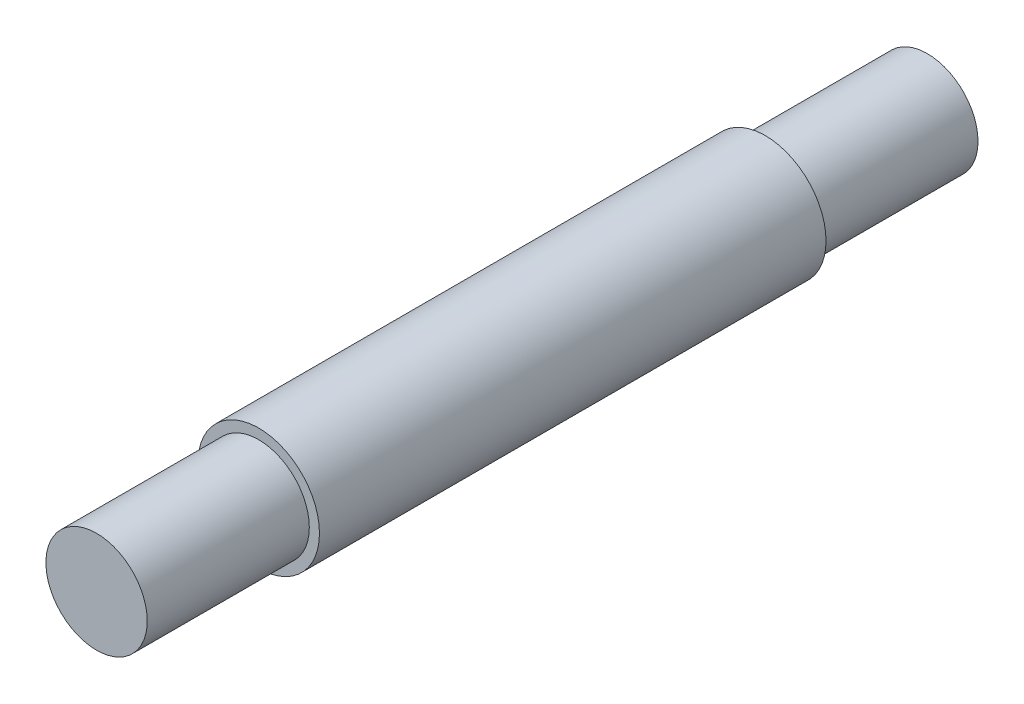
ISO-10303-21;
HEADER;
FILE_DESCRIPTION(('STEP AP214'),'2;1');
FILE_NAME('part.step','',(''),(''),'','','');
FILE_SCHEMA(('AUTOMOTIVE_DESIGN { 1 0 10303 214 1 1 1 1 }'));
ENDSEC;
DATA;
#1=APPLICATION_CONTEXT('core data for automotive mechanical design processes');
#2=APPLICATION_PROTOCOL_DEFINITION('international standard','automotive_design',2000,#1);
#3=PRODUCT_CONTEXT('',#1,'mechanical');
#4=PRODUCT('Part','Part','',(#3));
#5=PRODUCT_RELATED_PRODUCT_CATEGORY('part','',(#4));
#6=PRODUCT_DEFINITION_FORMATION('','',#4);
#7=PRODUCT_DEFINITION_CONTEXT('part definition',#1,'design');
#8=PRODUCT_DEFINITION('design','',#6,#7);
#9=PRODUCT_DEFINITION_SHAPE('','',#8);
#10=(LENGTH_UNIT() NAMED_UNIT(*) SI_UNIT(.MILLI.,.METRE.));
#11=(NAMED_UNIT(*) PLANE_ANGLE_UNIT() SI_UNIT($,.RADIAN.));
#12=(NAMED_UNIT(*) SI_UNIT($,.STERADIAN.) SOLID_ANGLE_UNIT());
#13=UNCERTAINTY_MEASURE_WITH_UNIT(LENGTH_MEASURE(1.E-05),#10,'distance_accuracy_value','');
#14=(GEOMETRIC_REPRESENTATION_CONTEXT(3) GLOBAL_UNCERTAINTY_ASSIGNED_CONTEXT((#13)) GLOBAL_UNIT_ASSIGNED_CONTEXT((#10,
#11,#12)) REPRESENTATION_CONTEXT('',''));
#15=CARTESIAN_POINT('',(0.,0.,0.));
#16=DIRECTION('',(0.,0.,1.));
#17=DIRECTION('',(1.,0.,0.));
#18=AXIS2_PLACEMENT_3D('',#15,#16,#17);
#19=CARTESIAN_POINT('',(0.,17.6167664670659,46.7245508982036));
#20=DIRECTION('',(0.,0.,-1.));
#21=DIRECTION('',(-1.,0.,0.));
#22=AXIS2_PLACEMENT_3D('',#19,#20,#21);
#23=PLANE('',#22);
#24=CARTESIAN_POINT('',(0.,11.6167664670659,46.7245508982036));
#25=DIRECTION('',(0.,0.,1.));
#26=DIRECTION('',(1.,0.,0.));
#27=AXIS2_PLACEMENT_3D('',#24,#25,#26);
#28=CIRCLE('',#27,5.);
#29=CARTESIAN_POINT('',(5.,11.6167664670659,46.7245508982036));
#30=VERTEX_POINT('',#29);
#31=EDGE_CURVE('E10',#30,#30,#28,.T.);
#32=ORIENTED_EDGE('',*,*,#31,.F.);
#33=EDGE_LOOP('',(#32));
#34=FACE_BOUND('',#33,.T.);
#35=CARTESIAN_POINT('',(0.,11.6167664670659,46.7245508982036));
#36=DIRECTION('',(0.,0.,1.));
#37=DIRECTION('',(1.,0.,0.));
#38=AXIS2_PLACEMENT_3D('',#35,#36,#37);
#39=CIRCLE('',#38,6.);
#40=CARTESIAN_POINT('',(6.,11.6167664670659,46.7245508982036));
#41=VERTEX_POINT('',#40);
#42=EDGE_CURVE('E70',#41,#41,#39,.T.);
#43=ORIENTED_EDGE('',*,*,#42,.T.);
#44=EDGE_LOOP('',(#43));
#45=FACE_BOUND('',#44,.T.);
#46=ADVANCED_FACE('F43',(#34,#45),#23,.F.);
#47=CARTESIAN_POINT('',(0.,11.6167664670659,62.7245508982036));
#48=DIRECTION('',(0.,0.,1.));
#49=DIRECTION('',(1.,0.,0.));
#50=AXIS2_PLACEMENT_3D('',#47,#48,#49);
#51=CYLINDRICAL_SURFACE('',#50,5.);
#52=CARTESIAN_POINT('',(0.,11.6167664670659,62.7245508982036));
#53=DIRECTION('',(0.,0.,1.));
#54=DIRECTION('',(1.,0.,0.));
#55=AXIS2_PLACEMENT_3D('',#52,#53,#54);
#56=CIRCLE('',#55,5.);
#57=CARTESIAN_POINT('',(5.,11.6167664670659,62.7245508982036));
#58=VERTEX_POINT('',#57);
#59=EDGE_CURVE('E50',#58,#58,#56,.T.);
#60=ORIENTED_EDGE('',*,*,#59,.F.);
#61=EDGE_LOOP('',(#60));
#62=FACE_BOUND('',#61,.T.);
#63=ORIENTED_EDGE('',*,*,#31,.T.);
#64=EDGE_LOOP('',(#63));
#65=FACE_BOUND('',#64,.T.);
#66=ADVANCED_FACE('F101',(#62,#65),#51,.T.);
#67=CARTESIAN_POINT('',(0.,16.6167664670659,62.7245508982036));
#68=DIRECTION('',(0.,0.,-1.));
#69=DIRECTION('',(-1.,0.,0.));
#70=AXIS2_PLACEMENT_3D('',#67,#68,#69);
#71=PLANE('',#70);
#72=ORIENTED_EDGE('',*,*,#59,.T.);
#73=EDGE_LOOP('',(#72));
#74=FACE_BOUND('',#73,.T.);
#75=ADVANCED_FACE('F96',(#74),#71,.F.);
#76=CARTESIAN_POINT('',(0.,16.6167664670659,-19.2754491017964));
#77=DIRECTION('',(0.,0.,1.));
#78=DIRECTION('',(1.,0.,0.));
#79=AXIS2_PLACEMENT_3D('',#76,#77,#78);
#80=PLANE('',#79);
#81=CARTESIAN_POINT('',(0.,11.6167664670659,-19.2754491017964));
#82=DIRECTION('',(0.,0.,1.));
#83=DIRECTION('',(1.,0.,0.));
#84=AXIS2_PLACEMENT_3D('',#81,#82,#83);
#85=CIRCLE('',#84,5.);
#86=CARTESIAN_POINT('',(5.,11.6167664670659,-19.2754491017964));
#87=VERTEX_POINT('',#86);
#88=EDGE_CURVE('E55',#87,#87,#85,.T.);
#89=ORIENTED_EDGE('',*,*,#88,.F.);
#90=EDGE_LOOP('',(#89));
#91=FACE_BOUND('',#90,.T.);
#92=ADVANCED_FACE('F91',(#91),#80,.F.);
#93=CARTESIAN_POINT('',(0.,11.6167664670659,62.7245508982036));
#94=DIRECTION('',(0.,0.,1.));
#95=DIRECTION('',(1.,0.,0.));
#96=AXIS2_PLACEMENT_3D('',#93,#94,#95);
#97=CYLINDRICAL_SURFACE('',#96,5.);
#98=CARTESIAN_POINT('',(0.,11.6167664670659,-3.2754491017964));
#99=DIRECTION('',(0.,0.,1.));
#100=DIRECTION('',(1.,0.,0.));
#101=AXIS2_PLACEMENT_3D('',#98,#99,#100);
#102=CIRCLE('',#101,5.);
#103=CARTESIAN_POINT('',(5.,11.6167664670659,-3.2754491017964));
#104=VERTEX_POINT('',#103);
#105=EDGE_CURVE('E60',#104,#104,#102,.T.);
#106=ORIENTED_EDGE('',*,*,#105,.F.);
#107=EDGE_LOOP('',(#106));
#108=FACE_BOUND('',#107,.T.);
#109=ORIENTED_EDGE('',*,*,#88,.T.);
#110=EDGE_LOOP('',(#109));
#111=FACE_BOUND('',#110,.T.);
#112=ADVANCED_FACE('F85',(#108,#111),#97,.T.);
#113=CARTESIAN_POINT('',(0.,17.6167664670659,-3.2754491017964));
#114=DIRECTION('',(0.,0.,1.));
#115=DIRECTION('',(1.,0.,0.));
#116=AXIS2_PLACEMENT_3D('',#113,#114,#115);
#117=PLANE('',#116);
#118=CARTESIAN_POINT('',(0.,11.6167664670659,-3.2754491017964));
#119=DIRECTION('',(0.,0.,1.));
#120=DIRECTION('',(1.,0.,0.));
#121=AXIS2_PLACEMENT_3D('',#118,#119,#120);
#122=CIRCLE('',#121,6.);
#123=CARTESIAN_POINT('',(6.,11.6167664670659,-3.2754491017964));
#124=VERTEX_POINT('',#123);
#125=EDGE_CURVE('E66',#124,#124,#122,.T.);
#126=ORIENTED_EDGE('',*,*,#125,.F.);
#127=EDGE_LOOP('',(#126));
#128=FACE_BOUND('',#127,.T.);
#129=ORIENTED_EDGE('',*,*,#105,.T.);
#130=EDGE_LOOP('',(#129));
#131=FACE_BOUND('',#130,.T.);
#132=ADVANCED_FACE('F79',(#128,#131),#117,.F.);
#133=CARTESIAN_POINT('',(0.,11.6167664670659,62.7245508982036));
#134=DIRECTION('',(0.,0.,1.));
#135=DIRECTION('',(1.,0.,0.));
#136=AXIS2_PLACEMENT_3D('',#133,#134,#135);
#137=CYLINDRICAL_SURFACE('',#136,6.);
#138=ORIENTED_EDGE('',*,*,#42,.F.);
#139=EDGE_LOOP('',(#138));
#140=FACE_BOUND('',#139,.T.);
#141=ORIENTED_EDGE('',*,*,#125,.T.);
#142=EDGE_LOOP('',(#141));
#143=FACE_BOUND('',#142,.T.);
#144=ADVANCED_FACE('F76',(#140,#143),#137,.T.);
#145=CLOSED_SHELL('',(#46,#66,#75,#92,#112,#132,#144));
#146=MANIFOLD_SOLID_BREP('B2',#145);
#147=ADVANCED_BREP_SHAPE_REPRESENTATION('',(#18,#146),#14);
#148=SHAPE_DEFINITION_REPRESENTATION(#9,#147);
ENDSEC;
END-ISO-10303-21;
